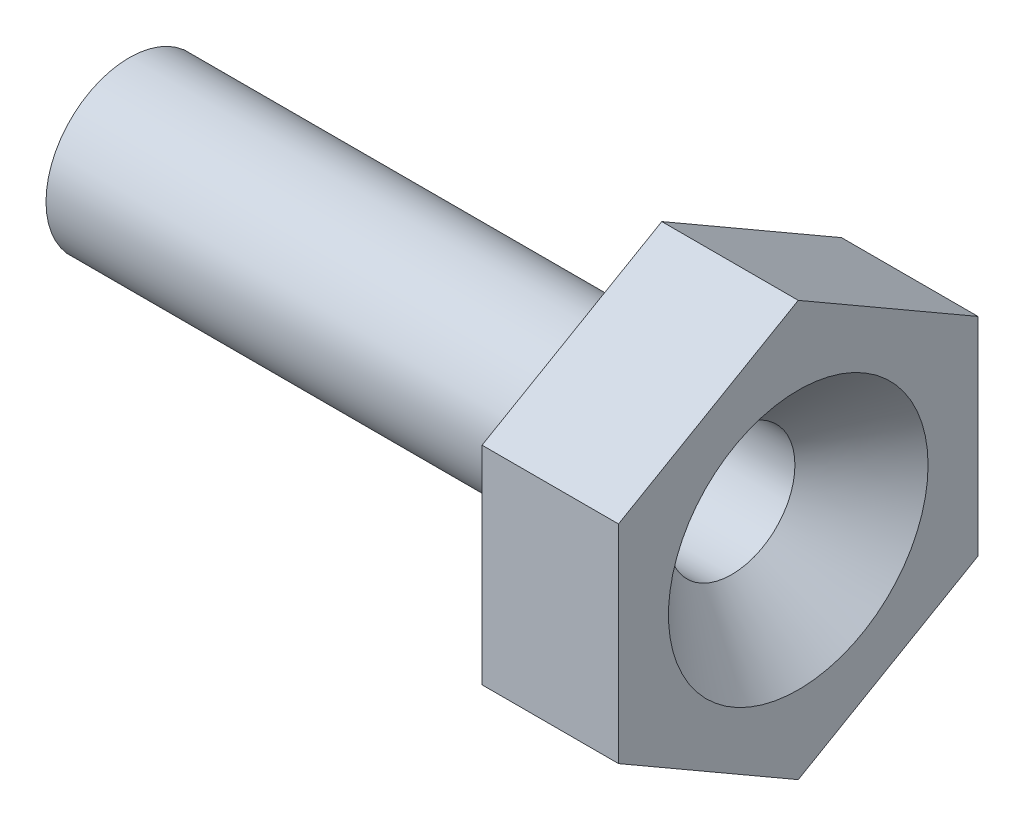
ISO-10303-21;
HEADER;
FILE_DESCRIPTION(('STEP AP214'),'2;1');
FILE_NAME('part.step','',(''),(''),'','','');
FILE_SCHEMA(('AUTOMOTIVE_DESIGN { 1 0 10303 214 1 1 1 1 }'));
ENDSEC;
DATA;
#1=APPLICATION_CONTEXT('core data for automotive mechanical design processes');
#2=APPLICATION_PROTOCOL_DEFINITION('international standard','automotive_design',2000,#1);
#3=PRODUCT_CONTEXT('',#1,'mechanical');
#4=PRODUCT('Part','Part','',(#3));
#5=PRODUCT_RELATED_PRODUCT_CATEGORY('part','',(#4));
#6=PRODUCT_DEFINITION_FORMATION('','',#4);
#7=PRODUCT_DEFINITION_CONTEXT('part definition',#1,'design');
#8=PRODUCT_DEFINITION('design','',#6,#7);
#9=PRODUCT_DEFINITION_SHAPE('','',#8);
#10=(LENGTH_UNIT() NAMED_UNIT(*) SI_UNIT(.MILLI.,.METRE.));
#11=(NAMED_UNIT(*) PLANE_ANGLE_UNIT() SI_UNIT($,.RADIAN.));
#12=(NAMED_UNIT(*) SI_UNIT($,.STERADIAN.) SOLID_ANGLE_UNIT());
#13=UNCERTAINTY_MEASURE_WITH_UNIT(LENGTH_MEASURE(1.E-05),#10,'distance_accuracy_value','');
#14=(GEOMETRIC_REPRESENTATION_CONTEXT(3) GLOBAL_UNCERTAINTY_ASSIGNED_CONTEXT((#13)) GLOBAL_UNIT_ASSIGNED_CONTEXT((#10,
#11,#12)) REPRESENTATION_CONTEXT('',''));
#15=CARTESIAN_POINT('',(0.,0.,0.));
#16=DIRECTION('',(0.,0.,1.));
#17=DIRECTION('',(1.,0.,0.));
#18=AXIS2_PLACEMENT_3D('',#15,#16,#17);
#19=CARTESIAN_POINT('',(0.,0.,0.));
#20=DIRECTION('',(1.,0.,0.));
#21=DIRECTION('',(0.,0.,-1.));
#22=AXIS2_PLACEMENT_3D('',#19,#20,#21);
#23=PLANE('',#22);
#24=DIRECTION('',(0.,-0.500000000000001,-0.866025403784438));
#25=VECTOR('',#24,1.);
#26=CARTESIAN_POINT('',(0.,-1.55884572681199,2.7));
#27=LINE('',#26,#25);
#28=CARTESIAN_POINT('',(0.,-1.55884572681199,2.7));
#29=VERTEX_POINT('',#28);
#30=CARTESIAN_POINT('',(0.,-3.11769145362398,0.));
#31=VERTEX_POINT('',#30);
#32=EDGE_CURVE('E118',#29,#31,#27,.T.);
#33=ORIENTED_EDGE('',*,*,#32,.F.);
#34=DIRECTION('',(0.,-1.,0.));
#35=VECTOR('',#34,1.);
#36=CARTESIAN_POINT('',(0.,1.55884572681199,2.7));
#37=LINE('',#36,#35);
#38=CARTESIAN_POINT('',(0.,1.55884572681199,2.7));
#39=VERTEX_POINT('',#38);
#40=EDGE_CURVE('E78',#39,#29,#37,.T.);
#41=ORIENTED_EDGE('',*,*,#40,.F.);
#42=DIRECTION('',(0.,-0.499999999999999,0.866025403784439));
#43=VECTOR('',#42,1.);
#44=CARTESIAN_POINT('',(0.,3.11769145362398,0.));
#45=LINE('',#44,#43);
#46=CARTESIAN_POINT('',(0.,3.11769145362398,0.));
#47=VERTEX_POINT('',#46);
#48=EDGE_CURVE('E72',#47,#39,#45,.T.);
#49=ORIENTED_EDGE('',*,*,#48,.F.);
#50=DIRECTION('',(0.,0.499999999999999,0.866025403784439));
#51=VECTOR('',#50,1.);
#52=CARTESIAN_POINT('',(0.,1.55884572681199,-2.7));
#53=LINE('',#52,#51);
#54=CARTESIAN_POINT('',(0.,1.55884572681199,-2.7));
#55=VERTEX_POINT('',#54);
#56=EDGE_CURVE('E108',#55,#47,#53,.T.);
#57=ORIENTED_EDGE('',*,*,#56,.F.);
#58=DIRECTION('',(0.,1.,0.));
#59=VECTOR('',#58,1.);
#60=CARTESIAN_POINT('',(0.,-1.55884572681199,-2.7));
#61=LINE('',#60,#59);
#62=CARTESIAN_POINT('',(0.,-1.55884572681199,-2.7));
#63=VERTEX_POINT('',#62);
#64=EDGE_CURVE('E124',#63,#55,#61,.T.);
#65=ORIENTED_EDGE('',*,*,#64,.F.);
#66=DIRECTION('',(0.,0.5,-0.866025403784439));
#67=VECTOR('',#66,1.);
#68=CARTESIAN_POINT('',(0.,-3.11769145362398,0.));
#69=LINE('',#68,#67);
#70=EDGE_CURVE('E121',#31,#63,#69,.T.);
#71=ORIENTED_EDGE('',*,*,#70,.F.);
#72=EDGE_LOOP('',(#33,#41,#49,#57,#65,#71));
#73=FACE_BOUND('',#72,.T.);
#74=CARTESIAN_POINT('',(0.,0.,0.));
#75=DIRECTION('',(1.,0.,0.));
#76=DIRECTION('',(0.,0.,-1.));
#77=AXIS2_PLACEMENT_3D('',#74,#75,#76);
#78=CIRCLE('',#77,1.25);
#79=CARTESIAN_POINT('',(0.,0.,-1.25));
#80=VERTEX_POINT('',#79);
#81=EDGE_CURVE('E138',#80,#80,#78,.F.);
#82=ORIENTED_EDGE('',*,*,#81,.F.);
#83=EDGE_LOOP('',(#82));
#84=FACE_BOUND('',#83,.T.);
#85=ADVANCED_FACE('F32',(#73,#84),#23,.F.);
#86=CARTESIAN_POINT('',(2.05,-1.55884572681199,2.7));
#87=DIRECTION('',(0.,0.866025403784438,-0.500000000000001));
#88=DIRECTION('',(0.,0.500000000000001,0.866025403784438));
#89=AXIS2_PLACEMENT_3D('',#86,#87,#88);
#90=PLANE('',#89);
#91=ORIENTED_EDGE('',*,*,#32,.T.);
#92=DIRECTION('',(-1.,0.,0.));
#93=VECTOR('',#92,1.);
#94=CARTESIAN_POINT('',(2.05,-3.11769145362398,0.));
#95=LINE('',#94,#93);
#96=CARTESIAN_POINT('',(2.05,-3.11769145362398,0.));
#97=VERTEX_POINT('',#96);
#98=EDGE_CURVE('E136',#97,#31,#95,.T.);
#99=ORIENTED_EDGE('',*,*,#98,.F.);
#100=DIRECTION('',(0.,-0.500000000000001,-0.866025403784438));
#101=VECTOR('',#100,1.);
#102=CARTESIAN_POINT('',(2.05,-1.55884572681199,2.7));
#103=LINE('',#102,#101);
#104=CARTESIAN_POINT('',(2.05,-1.55884572681199,2.7));
#105=VERTEX_POINT('',#104);
#106=EDGE_CURVE('E129',#105,#97,#103,.T.);
#107=ORIENTED_EDGE('',*,*,#106,.F.);
#108=DIRECTION('',(-1.,0.,0.));
#109=VECTOR('',#108,1.);
#110=CARTESIAN_POINT('',(2.05,-1.55884572681199,2.7));
#111=LINE('',#110,#109);
#112=EDGE_CURVE('E114',#105,#29,#111,.T.);
#113=ORIENTED_EDGE('',*,*,#112,.T.);
#114=EDGE_LOOP('',(#91,#99,#107,#113));
#115=FACE_BOUND('',#114,.T.);
#116=ADVANCED_FACE('F155',(#115),#90,.F.);
#117=CARTESIAN_POINT('',(2.05,-3.11769145362398,0.));
#118=DIRECTION('',(0.,0.866025403784439,0.5));
#119=DIRECTION('',(0.,-0.5,0.866025403784439));
#120=AXIS2_PLACEMENT_3D('',#117,#118,#119);
#121=PLANE('',#120);
#122=ORIENTED_EDGE('',*,*,#70,.T.);
#123=DIRECTION('',(-1.,0.,0.));
#124=VECTOR('',#123,1.);
#125=CARTESIAN_POINT('',(2.05,-1.55884572681199,-2.7));
#126=LINE('',#125,#124);
#127=CARTESIAN_POINT('',(2.05,-1.55884572681199,-2.7));
#128=VERTEX_POINT('',#127);
#129=EDGE_CURVE('E133',#128,#63,#126,.T.);
#130=ORIENTED_EDGE('',*,*,#129,.F.);
#131=DIRECTION('',(0.,0.5,-0.866025403784439));
#132=VECTOR('',#131,1.);
#133=CARTESIAN_POINT('',(2.05,-3.11769145362398,0.));
#134=LINE('',#133,#132);
#135=EDGE_CURVE('E87',#97,#128,#134,.T.);
#136=ORIENTED_EDGE('',*,*,#135,.F.);
#137=ORIENTED_EDGE('',*,*,#98,.T.);
#138=EDGE_LOOP('',(#122,#130,#136,#137));
#139=FACE_BOUND('',#138,.T.);
#140=ADVANCED_FACE('F161',(#139),#121,.F.);
#141=CARTESIAN_POINT('',(2.05,-1.55884572681199,-2.7));
#142=DIRECTION('',(0.,0.,1.));
#143=DIRECTION('',(1.,0.,0.));
#144=AXIS2_PLACEMENT_3D('',#141,#142,#143);
#145=PLANE('',#144);
#146=ORIENTED_EDGE('',*,*,#64,.T.);
#147=DIRECTION('',(-1.,0.,0.));
#148=VECTOR('',#147,1.);
#149=CARTESIAN_POINT('',(2.05,1.55884572681199,-2.7));
#150=LINE('',#149,#148);
#151=CARTESIAN_POINT('',(2.05,1.55884572681199,-2.7));
#152=VERTEX_POINT('',#151);
#153=EDGE_CURVE('E109',#152,#55,#150,.T.);
#154=ORIENTED_EDGE('',*,*,#153,.F.);
#155=DIRECTION('',(0.,1.,0.));
#156=VECTOR('',#155,1.);
#157=CARTESIAN_POINT('',(2.05,-1.55884572681199,-2.7));
#158=LINE('',#157,#156);
#159=EDGE_CURVE('E100',#128,#152,#158,.T.);
#160=ORIENTED_EDGE('',*,*,#159,.F.);
#161=ORIENTED_EDGE('',*,*,#129,.T.);
#162=EDGE_LOOP('',(#146,#154,#160,#161));
#163=FACE_BOUND('',#162,.T.);
#164=ADVANCED_FACE('F175',(#163),#145,.F.);
#165=CARTESIAN_POINT('',(2.05,1.55884572681199,-2.7));
#166=DIRECTION('',(0.,-0.866025403784439,0.499999999999999));
#167=DIRECTION('',(0.,-0.499999999999999,-0.866025403784439));
#168=AXIS2_PLACEMENT_3D('',#165,#166,#167);
#169=PLANE('',#168);
#170=ORIENTED_EDGE('',*,*,#56,.T.);
#171=DIRECTION('',(-1.,0.,0.));
#172=VECTOR('',#171,1.);
#173=CARTESIAN_POINT('',(2.05,3.11769145362398,0.));
#174=LINE('',#173,#172);
#175=CARTESIAN_POINT('',(2.05,3.11769145362398,0.));
#176=VERTEX_POINT('',#175);
#177=EDGE_CURVE('E105',#176,#47,#174,.T.);
#178=ORIENTED_EDGE('',*,*,#177,.F.);
#179=DIRECTION('',(0.,0.499999999999999,0.866025403784439));
#180=VECTOR('',#179,1.);
#181=CARTESIAN_POINT('',(2.05,1.55884572681199,-2.7));
#182=LINE('',#181,#180);
#183=EDGE_CURVE('E94',#152,#176,#182,.T.);
#184=ORIENTED_EDGE('',*,*,#183,.F.);
#185=ORIENTED_EDGE('',*,*,#153,.T.);
#186=EDGE_LOOP('',(#170,#178,#184,#185));
#187=FACE_BOUND('',#186,.T.);
#188=ADVANCED_FACE('F106',(#187),#169,.F.);
#189=CARTESIAN_POINT('',(2.05,3.11769145362398,0.));
#190=DIRECTION('',(0.,-0.866025403784439,-0.499999999999999));
#191=DIRECTION('',(0.,0.499999999999999,-0.866025403784439));
#192=AXIS2_PLACEMENT_3D('',#189,#190,#191);
#193=PLANE('',#192);
#194=ORIENTED_EDGE('',*,*,#48,.T.);
#195=DIRECTION('',(-1.,0.,0.));
#196=VECTOR('',#195,1.);
#197=CARTESIAN_POINT('',(2.05,1.55884572681199,2.7));
#198=LINE('',#197,#196);
#199=CARTESIAN_POINT('',(2.05,1.55884572681199,2.7));
#200=VERTEX_POINT('',#199);
#201=EDGE_CURVE('E110',#200,#39,#198,.T.);
#202=ORIENTED_EDGE('',*,*,#201,.F.);
#203=DIRECTION('',(0.,-0.499999999999999,0.866025403784439));
#204=VECTOR('',#203,1.);
#205=CARTESIAN_POINT('',(2.05,3.11769145362398,0.));
#206=LINE('',#205,#204);
#207=EDGE_CURVE('E98',#176,#200,#206,.T.);
#208=ORIENTED_EDGE('',*,*,#207,.F.);
#209=ORIENTED_EDGE('',*,*,#177,.T.);
#210=EDGE_LOOP('',(#194,#202,#208,#209));
#211=FACE_BOUND('',#210,.T.);
#212=ADVANCED_FACE('F112',(#211),#193,.F.);
#213=CARTESIAN_POINT('',(2.05,1.55884572681199,2.7));
#214=DIRECTION('',(0.,0.,-1.));
#215=DIRECTION('',(0.,1.,0.));
#216=AXIS2_PLACEMENT_3D('',#213,#214,#215);
#217=PLANE('',#216);
#218=ORIENTED_EDGE('',*,*,#40,.T.);
#219=ORIENTED_EDGE('',*,*,#112,.F.);
#220=DIRECTION('',(0.,-1.,0.));
#221=VECTOR('',#220,1.);
#222=CARTESIAN_POINT('',(2.05,1.55884572681199,2.7));
#223=LINE('',#222,#221);
#224=EDGE_CURVE('E49',#200,#105,#223,.T.);
#225=ORIENTED_EDGE('',*,*,#224,.F.);
#226=ORIENTED_EDGE('',*,*,#201,.T.);
#227=EDGE_LOOP('',(#218,#219,#225,#226));
#228=FACE_BOUND('',#227,.T.);
#229=ADVANCED_FACE('F168',(#228),#217,.F.);
#230=CARTESIAN_POINT('',(2.05,0.,0.));
#231=DIRECTION('',(1.,0.,0.));
#232=DIRECTION('',(0.,0.,-1.));
#233=AXIS2_PLACEMENT_3D('',#230,#231,#232);
#234=PLANE('',#233);
#235=CARTESIAN_POINT('',(2.05,0.,0.));
#236=DIRECTION('',(1.,0.,0.));
#237=DIRECTION('',(0.,0.,-1.));
#238=AXIS2_PLACEMENT_3D('',#235,#236,#237);
#239=CIRCLE('',#238,1.95);
#240=CARTESIAN_POINT('',(2.05,0.,-1.95));
#241=VERTEX_POINT('',#240);
#242=EDGE_CURVE('E41',#241,#241,#239,.F.);
#243=ORIENTED_EDGE('',*,*,#242,.T.);
#244=EDGE_LOOP('',(#243));
#245=FACE_BOUND('',#244,.T.);
#246=ORIENTED_EDGE('',*,*,#106,.T.);
#247=ORIENTED_EDGE('',*,*,#135,.T.);
#248=ORIENTED_EDGE('',*,*,#159,.T.);
#249=ORIENTED_EDGE('',*,*,#183,.T.);
#250=ORIENTED_EDGE('',*,*,#207,.T.);
#251=ORIENTED_EDGE('',*,*,#224,.T.);
#252=EDGE_LOOP('',(#246,#247,#248,#249,#250,#251));
#253=FACE_BOUND('',#252,.T.);
#254=ADVANCED_FACE('F96',(#245,#253),#234,.T.);
#255=CARTESIAN_POINT('',(-8.,0.,0.));
#256=DIRECTION('',(1.,0.,0.));
#257=DIRECTION('',(0.,0.,-1.));
#258=AXIS2_PLACEMENT_3D('',#255,#256,#257);
#259=CYLINDRICAL_SURFACE('',#258,1.25);
#260=CARTESIAN_POINT('',(-8.,0.,0.));
#261=DIRECTION('',(-1.,0.,0.));
#262=DIRECTION('',(0.,0.,1.));
#263=AXIS2_PLACEMENT_3D('',#260,#261,#262);
#264=CIRCLE('',#263,1.25);
#265=CARTESIAN_POINT('',(-8.,0.,1.25));
#266=VERTEX_POINT('',#265);
#267=EDGE_CURVE('E122',#266,#266,#264,.T.);
#268=ORIENTED_EDGE('',*,*,#267,.F.);
#269=EDGE_LOOP('',(#268));
#270=FACE_BOUND('',#269,.T.);
#271=ORIENTED_EDGE('',*,*,#81,.T.);
#272=EDGE_LOOP('',(#271));
#273=FACE_BOUND('',#272,.T.);
#274=ADVANCED_FACE('F197',(#270,#273),#259,.T.);
#275=CARTESIAN_POINT('',(-8.,0.,0.));
#276=DIRECTION('',(-1.,0.,0.));
#277=DIRECTION('',(0.,0.,1.));
#278=AXIS2_PLACEMENT_3D('',#275,#276,#277);
#279=PLANE('',#278);
#280=CARTESIAN_POINT('',(-8.,0.,0.));
#281=DIRECTION('',(-1.,0.,0.));
#282=DIRECTION('',(0.,0.,1.));
#283=AXIS2_PLACEMENT_3D('',#280,#281,#282);
#284=CIRCLE('',#283,0.95);
#285=CARTESIAN_POINT('',(-8.,0.,0.95));
#286=VERTEX_POINT('',#285);
#287=EDGE_CURVE('E190',#286,#286,#284,.T.);
#288=ORIENTED_EDGE('',*,*,#287,.F.);
#289=EDGE_LOOP('',(#288));
#290=FACE_BOUND('',#289,.T.);
#291=ORIENTED_EDGE('',*,*,#267,.T.);
#292=EDGE_LOOP('',(#291));
#293=FACE_BOUND('',#292,.T.);
#294=ADVANCED_FACE('F150',(#290,#293),#279,.T.);
#295=CARTESIAN_POINT('',(2.05,0.,0.));
#296=DIRECTION('',(-1.,0.,0.));
#297=DIRECTION('',(0.,0.,1.));
#298=AXIS2_PLACEMENT_3D('',#295,#296,#297);
#299=CYLINDRICAL_SURFACE('',#298,0.95);
#300=CARTESIAN_POINT('',(1.05,0.,0.));
#301=DIRECTION('',(1.,0.,0.));
#302=DIRECTION('',(0.,0.,-1.));
#303=AXIS2_PLACEMENT_3D('',#300,#301,#302);
#304=CIRCLE('',#303,0.95);
#305=CARTESIAN_POINT('',(1.05,0.,-0.95));
#306=VERTEX_POINT('',#305);
#307=EDGE_CURVE('E11',#306,#306,#304,.T.);
#308=ORIENTED_EDGE('',*,*,#307,.T.);
#309=EDGE_LOOP('',(#308));
#310=FACE_BOUND('',#309,.T.);
#311=ORIENTED_EDGE('',*,*,#287,.T.);
#312=EDGE_LOOP('',(#311));
#313=FACE_BOUND('',#312,.T.);
#314=ADVANCED_FACE('F145',(#310,#313),#299,.F.);
#315=CARTESIAN_POINT('',(2.05,0.,0.));
#316=DIRECTION('',(1.,0.,0.));
#317=DIRECTION('',(0.,0.,-1.));
#318=AXIS2_PLACEMENT_3D('',#315,#316,#317);
#319=CONICAL_SURFACE('',#318,1.95,0.785398163397447);
#320=ORIENTED_EDGE('',*,*,#307,.F.);
#321=EDGE_LOOP('',(#320));
#322=FACE_BOUND('',#321,.T.);
#323=ORIENTED_EDGE('',*,*,#242,.F.);
#324=EDGE_LOOP('',(#323));
#325=FACE_BOUND('',#324,.T.);
#326=ADVANCED_FACE('F34',(#322,#325),#319,.F.);
#327=CLOSED_SHELL('',(#85,#116,#140,#164,#188,#212,#229,#254,#274,#294,#314,#326));
#328=MANIFOLD_SOLID_BREP('B2',#327);
#329=ADVANCED_BREP_SHAPE_REPRESENTATION('',(#18,#328),#14);
#330=SHAPE_DEFINITION_REPRESENTATION(#9,#329);
ENDSEC;
END-ISO-10303-21;
